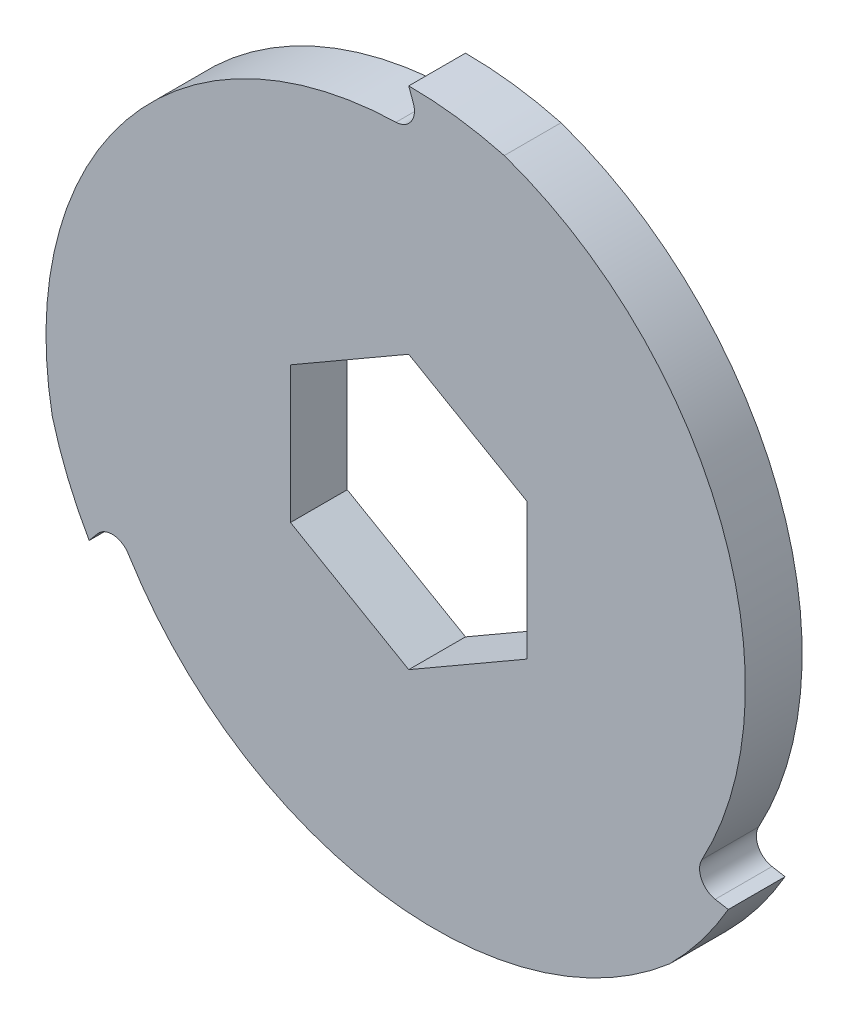
ISO-10303-21;
HEADER;
FILE_DESCRIPTION(('STEP AP214'),'2;1');
FILE_NAME('part.step','',(''),(''),'','','');
FILE_SCHEMA(('AUTOMOTIVE_DESIGN { 1 0 10303 214 1 1 1 1 }'));
ENDSEC;
DATA;
#1=APPLICATION_CONTEXT('core data for automotive mechanical design processes');
#2=APPLICATION_PROTOCOL_DEFINITION('international standard','automotive_design',2000,#1);
#3=PRODUCT_CONTEXT('',#1,'mechanical');
#4=PRODUCT('Part','Part','',(#3));
#5=PRODUCT_RELATED_PRODUCT_CATEGORY('part','',(#4));
#6=PRODUCT_DEFINITION_FORMATION('','',#4);
#7=PRODUCT_DEFINITION_CONTEXT('part definition',#1,'design');
#8=PRODUCT_DEFINITION('design','',#6,#7);
#9=PRODUCT_DEFINITION_SHAPE('','',#8);
#10=(LENGTH_UNIT() NAMED_UNIT(*) SI_UNIT(.MILLI.,.METRE.));
#11=(NAMED_UNIT(*) PLANE_ANGLE_UNIT() SI_UNIT($,.RADIAN.));
#12=(NAMED_UNIT(*) SI_UNIT($,.STERADIAN.) SOLID_ANGLE_UNIT());
#13=UNCERTAINTY_MEASURE_WITH_UNIT(LENGTH_MEASURE(1.E-05),#10,'distance_accuracy_value','');
#14=(GEOMETRIC_REPRESENTATION_CONTEXT(3) GLOBAL_UNCERTAINTY_ASSIGNED_CONTEXT((#13)) GLOBAL_UNIT_ASSIGNED_CONTEXT((#10,
#11,#12)) REPRESENTATION_CONTEXT('',''));
#15=CARTESIAN_POINT('',(0.,0.,0.));
#16=DIRECTION('',(0.,0.,1.));
#17=DIRECTION('',(1.,0.,0.));
#18=AXIS2_PLACEMENT_3D('',#15,#16,#17);
#19=CARTESIAN_POINT('',(43.463727065922,-10.6600377917538,3.));
#20=DIRECTION('',(-0.5,-0.866025403784438,0.));
#21=DIRECTION('',(0.866025403784439,-0.5,0.));
#22=AXIS2_PLACEMENT_3D('',#19,#20,#21);
#23=PLANE('',#22);
#24=DIRECTION('',(-0.866025403784439,0.5,0.));
#25=VECTOR('',#24,1.);
#26=CARTESIAN_POINT('',(43.463727065922,-10.6600377917538,-3.));
#27=LINE('',#26,#25);
#28=CARTESIAN_POINT('',(12.5,7.21687836487032,-3.));
#29=VERTEX_POINT('',#28);
#30=CARTESIAN_POINT('',(0.,14.4337567297407,-3.));
#31=VERTEX_POINT('',#30);
#32=EDGE_CURVE('E245',#29,#31,#27,.T.);
#33=ORIENTED_EDGE('',*,*,#32,.F.);
#34=DIRECTION('',(0.,0.,-1.));
#35=VECTOR('',#34,1.);
#36=CARTESIAN_POINT('',(12.5,7.21687836487032,3.));
#37=LINE('',#36,#35);
#38=CARTESIAN_POINT('',(12.5,7.21687836487032,3.));
#39=VERTEX_POINT('',#38);
#40=EDGE_CURVE('E268',#39,#29,#37,.T.);
#41=ORIENTED_EDGE('',*,*,#40,.F.);
#42=DIRECTION('',(-0.866025403784439,0.5,0.));
#43=VECTOR('',#42,1.);
#44=CARTESIAN_POINT('',(43.463727065922,-10.6600377917538,3.));
#45=LINE('',#44,#43);
#46=CARTESIAN_POINT('',(0.,14.4337567297407,3.));
#47=VERTEX_POINT('',#46);
#48=EDGE_CURVE('E208',#39,#47,#45,.T.);
#49=ORIENTED_EDGE('',*,*,#48,.T.);
#50=DIRECTION('',(0.,0.,-1.));
#51=VECTOR('',#50,1.);
#52=CARTESIAN_POINT('',(0.,14.4337567297407,3.));
#53=LINE('',#52,#51);
#54=EDGE_CURVE('E172',#47,#31,#53,.T.);
#55=ORIENTED_EDGE('',*,*,#54,.T.);
#56=EDGE_LOOP('',(#33,#41,#49,#55));
#57=FACE_BOUND('',#56,.T.);
#58=ADVANCED_FACE('F36',(#57),#23,.T.);
#59=CARTESIAN_POINT('',(12.5,-85.9414213562373,3.));
#60=DIRECTION('',(-1.,0.,0.));
#61=DIRECTION('',(0.,-1.,0.));
#62=AXIS2_PLACEMENT_3D('',#59,#60,#61);
#63=PLANE('',#62);
#64=DIRECTION('',(0.,1.,0.));
#65=VECTOR('',#64,1.);
#66=CARTESIAN_POINT('',(12.5,-85.9414213562373,-3.));
#67=LINE('',#66,#65);
#68=CARTESIAN_POINT('',(12.5,-7.21687836487031,-3.));
#69=VERTEX_POINT('',#68);
#70=EDGE_CURVE('E248',#69,#29,#67,.T.);
#71=ORIENTED_EDGE('',*,*,#70,.F.);
#72=DIRECTION('',(0.,0.,-1.));
#73=VECTOR('',#72,1.);
#74=CARTESIAN_POINT('',(12.5,-7.21687836487031,3.));
#75=LINE('',#74,#73);
#76=CARTESIAN_POINT('',(12.5,-7.21687836487031,3.));
#77=VERTEX_POINT('',#76);
#78=EDGE_CURVE('E266',#77,#69,#75,.T.);
#79=ORIENTED_EDGE('',*,*,#78,.F.);
#80=DIRECTION('',(0.,1.,0.));
#81=VECTOR('',#80,1.);
#82=CARTESIAN_POINT('',(12.5,-85.9414213562373,3.));
#83=LINE('',#82,#81);
#84=EDGE_CURVE('E211',#77,#39,#83,.T.);
#85=ORIENTED_EDGE('',*,*,#84,.T.);
#86=ORIENTED_EDGE('',*,*,#40,.T.);
#87=EDGE_LOOP('',(#71,#79,#85,#86));
#88=FACE_BOUND('',#87,.T.);
#89=ADVANCED_FACE('F320',(#88),#63,.T.);
#90=CARTESIAN_POINT('',(-30.963727065922,-32.3106728863648,3.));
#91=DIRECTION('',(-0.5,0.866025403784438,0.));
#92=DIRECTION('',(-0.866025403784439,-0.5,0.));
#93=AXIS2_PLACEMENT_3D('',#90,#91,#92);
#94=PLANE('',#93);
#95=DIRECTION('',(0.866025403784439,0.5,0.));
#96=VECTOR('',#95,1.);
#97=CARTESIAN_POINT('',(-30.963727065922,-32.3106728863648,-3.));
#98=LINE('',#97,#96);
#99=CARTESIAN_POINT('',(0.,-14.4337567297407,-3.));
#100=VERTEX_POINT('',#99);
#101=EDGE_CURVE('E251',#100,#69,#98,.T.);
#102=ORIENTED_EDGE('',*,*,#101,.F.);
#103=DIRECTION('',(0.,0.,-1.));
#104=VECTOR('',#103,1.);
#105=CARTESIAN_POINT('',(0.,-14.4337567297407,3.));
#106=LINE('',#105,#104);
#107=CARTESIAN_POINT('',(0.,-14.4337567297407,3.));
#108=VERTEX_POINT('',#107);
#109=EDGE_CURVE('E264',#108,#100,#106,.T.);
#110=ORIENTED_EDGE('',*,*,#109,.F.);
#111=DIRECTION('',(0.866025403784439,0.5,0.));
#112=VECTOR('',#111,1.);
#113=CARTESIAN_POINT('',(-30.963727065922,-32.3106728863648,3.));
#114=LINE('',#113,#112);
#115=EDGE_CURVE('E214',#108,#77,#114,.T.);
#116=ORIENTED_EDGE('',*,*,#115,.T.);
#117=ORIENTED_EDGE('',*,*,#78,.T.);
#118=EDGE_LOOP('',(#102,#110,#116,#117));
#119=FACE_BOUND('',#118,.T.);
#120=ADVANCED_FACE('F326',(#119),#94,.T.);
#121=CARTESIAN_POINT('',(30.963727065922,-32.3106728863648,3.));
#122=DIRECTION('',(0.5,0.866025403784439,0.));
#123=DIRECTION('',(-0.866025403784439,0.5,0.));
#124=AXIS2_PLACEMENT_3D('',#121,#122,#123);
#125=PLANE('',#124);
#126=DIRECTION('',(0.866025403784439,-0.5,0.));
#127=VECTOR('',#126,1.);
#128=CARTESIAN_POINT('',(30.963727065922,-32.3106728863648,-3.));
#129=LINE('',#128,#127);
#130=CARTESIAN_POINT('',(-12.5,-7.21687836487032,-3.));
#131=VERTEX_POINT('',#130);
#132=EDGE_CURVE('E254',#131,#100,#129,.T.);
#133=ORIENTED_EDGE('',*,*,#132,.F.);
#134=DIRECTION('',(0.,0.,-1.));
#135=VECTOR('',#134,1.);
#136=CARTESIAN_POINT('',(-12.5,-7.21687836487032,3.));
#137=LINE('',#136,#135);
#138=CARTESIAN_POINT('',(-12.5,-7.21687836487032,3.));
#139=VERTEX_POINT('',#138);
#140=EDGE_CURVE('E262',#139,#131,#137,.T.);
#141=ORIENTED_EDGE('',*,*,#140,.F.);
#142=DIRECTION('',(0.866025403784439,-0.5,0.));
#143=VECTOR('',#142,1.);
#144=CARTESIAN_POINT('',(30.963727065922,-32.3106728863648,3.));
#145=LINE('',#144,#143);
#146=EDGE_CURVE('E217',#139,#108,#145,.T.);
#147=ORIENTED_EDGE('',*,*,#146,.T.);
#148=ORIENTED_EDGE('',*,*,#109,.T.);
#149=EDGE_LOOP('',(#133,#141,#147,#148));
#150=FACE_BOUND('',#149,.T.);
#151=ADVANCED_FACE('F361',(#150),#125,.T.);
#152=CARTESIAN_POINT('',(-12.5,-85.9414213562373,3.));
#153=DIRECTION('',(1.,0.,0.));
#154=DIRECTION('',(0.,1.,0.));
#155=AXIS2_PLACEMENT_3D('',#152,#153,#154);
#156=PLANE('',#155);
#157=DIRECTION('',(0.,-1.,0.));
#158=VECTOR('',#157,1.);
#159=CARTESIAN_POINT('',(-12.5,-85.9414213562373,-3.));
#160=LINE('',#159,#158);
#161=CARTESIAN_POINT('',(-12.5,7.21687836487034,-3.));
#162=VERTEX_POINT('',#161);
#163=EDGE_CURVE('E194',#162,#131,#160,.T.);
#164=ORIENTED_EDGE('',*,*,#163,.F.);
#165=DIRECTION('',(0.,0.,-1.));
#166=VECTOR('',#165,1.);
#167=CARTESIAN_POINT('',(-12.5,7.21687836487034,3.));
#168=LINE('',#167,#166);
#169=CARTESIAN_POINT('',(-12.5,7.21687836487034,3.));
#170=VERTEX_POINT('',#169);
#171=EDGE_CURVE('E260',#170,#162,#168,.T.);
#172=ORIENTED_EDGE('',*,*,#171,.F.);
#173=DIRECTION('',(0.,-1.,0.));
#174=VECTOR('',#173,1.);
#175=CARTESIAN_POINT('',(-12.5,-85.9414213562373,3.));
#176=LINE('',#175,#174);
#177=EDGE_CURVE('E220',#170,#139,#176,.T.);
#178=ORIENTED_EDGE('',*,*,#177,.T.);
#179=ORIENTED_EDGE('',*,*,#140,.T.);
#180=EDGE_LOOP('',(#164,#172,#178,#179));
#181=FACE_BOUND('',#180,.T.);
#182=ADVANCED_FACE('F356',(#181),#156,.T.);
#183=CARTESIAN_POINT('',(-0.34147695629755,-2.98769874534794,3.));
#184=DIRECTION('',(0.,0.,-1.));
#185=DIRECTION('',(-1.,0.,0.));
#186=AXIS2_PLACEMENT_3D('',#183,#184,#185);
#187=CYLINDRICAL_SURFACE('',#186,38.0000000000001);
#188=CARTESIAN_POINT('',(-0.34147695629755,-2.98769874534794,3.));
#189=DIRECTION('',(0.,0.,1.));
#190=DIRECTION('',(1.,0.,0.));
#191=AXIS2_PLACEMENT_3D('',#188,#189,#190);
#192=CIRCLE('',#191,38.0000000000001);
#193=CARTESIAN_POINT('',(-37.671107225274,-10.0939427589969,3.));
#194=VERTEX_POINT('',#193);
#195=CARTESIAN_POINT('',(-1.34687977799022,34.9989984678363,3.));
#196=VERTEX_POINT('',#195);
#197=EDGE_CURVE('E166',#194,#196,#192,.F.);
#198=ORIENTED_EDGE('',*,*,#197,.T.);
#199=DIRECTION('',(0.,0.,-1.));
#200=VECTOR('',#199,1.);
#201=CARTESIAN_POINT('',(-1.34687977799022,34.9989984678363,3.));
#202=LINE('',#201,#200);
#203=CARTESIAN_POINT('',(-1.34687977799022,34.9989984678363,-3.));
#204=VERTEX_POINT('',#203);
#205=EDGE_CURVE('E285',#196,#204,#202,.T.);
#206=ORIENTED_EDGE('',*,*,#205,.T.);
#207=CARTESIAN_POINT('',(-0.34147695629755,-2.98769874534794,-3.));
#208=DIRECTION('',(0.,0.,1.));
#209=DIRECTION('',(1.,0.,0.));
#210=AXIS2_PLACEMENT_3D('',#207,#208,#209);
#211=CIRCLE('',#210,38.0000000000001);
#212=CARTESIAN_POINT('',(-37.671107225274,-10.0939427589969,-3.));
#213=VERTEX_POINT('',#212);
#214=EDGE_CURVE('E169',#213,#204,#211,.F.);
#215=ORIENTED_EDGE('',*,*,#214,.F.);
#216=DIRECTION('',(0.,0.,-1.));
#217=VECTOR('',#216,1.);
#218=CARTESIAN_POINT('',(-37.671107225274,-10.0939427589969,3.));
#219=LINE('',#218,#217);
#220=EDGE_CURVE('E161',#194,#213,#219,.T.);
#221=ORIENTED_EDGE('',*,*,#220,.F.);
#222=EDGE_LOOP('',(#198,#206,#215,#221));
#223=FACE_BOUND('',#222,.T.);
#224=ADVANCED_FACE('F163',(#223),#187,.T.);
#225=CARTESIAN_POINT('',(0.,0.,3.));
#226=DIRECTION('',(0.,0.,-1.));
#227=DIRECTION('',(-1.,0.,0.));
#228=AXIS2_PLACEMENT_3D('',#225,#226,#227);
#229=CYLINDRICAL_SURFACE('',#228,39.);
#230=CARTESIAN_POINT('',(0.,0.,-3.));
#231=DIRECTION('',(0.,0.,1.));
#232=DIRECTION('',(1.,0.,0.));
#233=AXIS2_PLACEMENT_3D('',#230,#231,#232);
#234=CIRCLE('',#233,39.);
#235=CARTESIAN_POINT('',(-33.7749907475925,-19.5000000000005,-3.));
#236=VERTEX_POINT('',#235);
#237=EDGE_CURVE('E228',#213,#236,#234,.T.);
#238=ORIENTED_EDGE('',*,*,#237,.T.);
#239=DIRECTION('',(0.,0.,-1.));
#240=VECTOR('',#239,1.);
#241=CARTESIAN_POINT('',(-33.7749907475925,-19.5000000000005,3.));
#242=LINE('',#241,#240);
#243=CARTESIAN_POINT('',(-33.7749907475925,-19.5000000000005,3.));
#244=VERTEX_POINT('',#243);
#245=EDGE_CURVE('E173',#244,#236,#242,.T.);
#246=ORIENTED_EDGE('',*,*,#245,.F.);
#247=CARTESIAN_POINT('',(0.,0.,3.));
#248=DIRECTION('',(0.,0.,1.));
#249=DIRECTION('',(1.,0.,0.));
#250=AXIS2_PLACEMENT_3D('',#247,#248,#249);
#251=CIRCLE('',#250,39.);
#252=EDGE_CURVE('E176',#194,#244,#251,.T.);
#253=ORIENTED_EDGE('',*,*,#252,.F.);
#254=ORIENTED_EDGE('',*,*,#220,.T.);
#255=EDGE_LOOP('',(#238,#246,#253,#254));
#256=FACE_BOUND('',#255,.T.);
#257=ADVANCED_FACE('F177',(#256),#229,.T.);
#258=CARTESIAN_POINT('',(-52.5359916072048,-41.8584901751143,3.));
#259=DIRECTION('',(-0.766044443119088,0.642787609686409,0.));
#260=DIRECTION('',(-0.642787609686409,-0.766044443119088,0.));
#261=AXIS2_PLACEMENT_3D('',#258,#259,#260);
#262=PLANE('',#261);
#263=DIRECTION('',(0.642787609686409,0.766044443119088,0.));
#264=VECTOR('',#263,1.);
#265=CARTESIAN_POINT('',(-52.5359916072048,-41.8584901751143,-3.));
#266=LINE('',#265,#264);
#267=CARTESIAN_POINT('',(-32.8736572711721,-18.4258325913506,-3.));
#268=VERTEX_POINT('',#267);
#269=EDGE_CURVE('E230',#236,#268,#266,.T.);
#270=ORIENTED_EDGE('',*,*,#269,.T.);
#271=DIRECTION('',(0.,0.,-1.));
#272=VECTOR('',#271,1.);
#273=CARTESIAN_POINT('',(-32.8736572711721,-18.4258325913506,3.));
#274=LINE('',#273,#272);
#275=CARTESIAN_POINT('',(-32.8736572711721,-18.4258325913506,3.));
#276=VERTEX_POINT('',#275);
#277=EDGE_CURVE('E283',#268,#276,#274,.F.);
#278=ORIENTED_EDGE('',*,*,#277,.T.);
#279=DIRECTION('',(0.642787609686409,0.766044443119088,0.));
#280=VECTOR('',#279,1.);
#281=CARTESIAN_POINT('',(-52.5359916072048,-41.8584901751143,3.));
#282=LINE('',#281,#280);
#283=EDGE_CURVE('E182',#244,#276,#282,.T.);
#284=ORIENTED_EDGE('',*,*,#283,.F.);
#285=ORIENTED_EDGE('',*,*,#245,.T.);
#286=EDGE_LOOP('',(#270,#278,#284,#285));
#287=FACE_BOUND('',#286,.T.);
#288=ADVANCED_FACE('F350',(#287),#262,.F.);
#289=CARTESIAN_POINT('',(2.75816149047498,1.1981216537133,3.));
#290=DIRECTION('',(0.,0.,-1.));
#291=DIRECTION('',(-1.,0.,0.));
#292=AXIS2_PLACEMENT_3D('',#289,#290,#291);
#293=CYLINDRICAL_SURFACE('',#292,38.);
#294=CARTESIAN_POINT('',(2.75816149047498,1.1981216537133,3.));
#295=DIRECTION('',(0.,0.,1.));
#296=DIRECTION('',(1.,0.,0.));
#297=AXIS2_PLACEMENT_3D('',#294,#295,#296);
#298=CIRCLE('',#297,38.);
#299=CARTESIAN_POINT('',(27.5771644662752,-27.5771644662755,3.));
#300=VERTEX_POINT('',#299);
#301=CARTESIAN_POINT('',(-29.6365818911634,-18.6659313375016,3.));
#302=VERTEX_POINT('',#301);
#303=EDGE_CURVE('E198',#300,#302,#298,.F.);
#304=ORIENTED_EDGE('',*,*,#303,.T.);
#305=DIRECTION('',(0.,0.,-1.));
#306=VECTOR('',#305,1.);
#307=CARTESIAN_POINT('',(-29.6365818911634,-18.6659313375016,3.));
#308=LINE('',#307,#306);
#309=CARTESIAN_POINT('',(-29.6365818911634,-18.6659313375016,-3.));
#310=VERTEX_POINT('',#309);
#311=EDGE_CURVE('E270',#302,#310,#308,.T.);
#312=ORIENTED_EDGE('',*,*,#311,.T.);
#313=CARTESIAN_POINT('',(2.75816149047498,1.1981216537133,-3.));
#314=DIRECTION('',(0.,0.,1.));
#315=DIRECTION('',(1.,0.,0.));
#316=AXIS2_PLACEMENT_3D('',#313,#314,#315);
#317=CIRCLE('',#316,38.);
#318=CARTESIAN_POINT('',(27.5771644662752,-27.5771644662755,-3.));
#319=VERTEX_POINT('',#318);
#320=EDGE_CURVE('E235',#319,#310,#317,.F.);
#321=ORIENTED_EDGE('',*,*,#320,.F.);
#322=DIRECTION('',(0.,0.,-1.));
#323=VECTOR('',#322,1.);
#324=CARTESIAN_POINT('',(27.5771644662752,-27.5771644662755,3.));
#325=LINE('',#324,#323);
#326=EDGE_CURVE('E278',#300,#319,#325,.T.);
#327=ORIENTED_EDGE('',*,*,#326,.F.);
#328=EDGE_LOOP('',(#304,#312,#321,#327));
#329=FACE_BOUND('',#328,.T.);
#330=ADVANCED_FACE('F347',(#329),#293,.T.);
#331=CARTESIAN_POINT('',(33.7749907475938,-19.4999999999997,-3.));
#332=VERTEX_POINT('',#331);
#333=EDGE_CURVE('E232',#319,#332,#234,.T.);
#334=ORIENTED_EDGE('',*,*,#333,.T.);
#335=DIRECTION('',(0.,0.,-1.));
#336=VECTOR('',#335,1.);
#337=CARTESIAN_POINT('',(33.7749907475938,-19.4999999999997,3.));
#338=LINE('',#337,#336);
#339=CARTESIAN_POINT('',(33.7749907475938,-19.4999999999997,3.));
#340=VERTEX_POINT('',#339);
#341=EDGE_CURVE('E275',#340,#332,#338,.T.);
#342=ORIENTED_EDGE('',*,*,#341,.F.);
#343=EDGE_CURVE('E185',#300,#340,#251,.T.);
#344=ORIENTED_EDGE('',*,*,#343,.F.);
#345=ORIENTED_EDGE('',*,*,#326,.T.);
#346=EDGE_LOOP('',(#334,#342,#344,#345));
#347=FACE_BOUND('',#346,.T.);
#348=ADVANCED_FACE('F340',(#347),#229,.T.);
#349=CARTESIAN_POINT('',(12.3805928149876,-15.7275904084699,3.));
#350=DIRECTION('',(-0.173648177666837,-0.984807753012224,0.));
#351=DIRECTION('',(0.984807753012224,-0.173648177666837,0.));
#352=AXIS2_PLACEMENT_3D('',#349,#350,#351);
#353=PLANE('',#352);
#354=DIRECTION('',(-0.984807753012224,0.173648177666837,0.));
#355=VECTOR('',#354,1.);
#356=CARTESIAN_POINT('',(12.3805928149876,-15.7275904084699,-3.));
#357=LINE('',#356,#355);
#358=CARTESIAN_POINT('',(32.3940677455747,-19.2565060164629,-3.));
#359=VERTEX_POINT('',#358);
#360=EDGE_CURVE('E238',#332,#359,#357,.T.);
#361=ORIENTED_EDGE('',*,*,#360,.T.);
#362=DIRECTION('',(0.,0.,-1.));
#363=VECTOR('',#362,1.);
#364=CARTESIAN_POINT('',(32.3940677455747,-19.2565060164629,3.));
#365=LINE('',#364,#363);
#366=CARTESIAN_POINT('',(32.3940677455747,-19.2565060164629,3.));
#367=VERTEX_POINT('',#366);
#368=EDGE_CURVE('E51',#359,#367,#365,.F.);
#369=ORIENTED_EDGE('',*,*,#368,.T.);
#370=DIRECTION('',(-0.984807753012224,0.173648177666837,0.));
#371=VECTOR('',#370,1.);
#372=CARTESIAN_POINT('',(12.3805928149876,-15.7275904084699,3.));
#373=LINE('',#372,#371);
#374=EDGE_CURVE('E201',#340,#367,#373,.T.);
#375=ORIENTED_EDGE('',*,*,#374,.F.);
#376=ORIENTED_EDGE('',*,*,#341,.T.);
#377=EDGE_LOOP('',(#361,#369,#375,#376));
#378=FACE_BOUND('',#377,.T.);
#379=ADVANCED_FACE('F343',(#378),#353,.F.);
#380=CARTESIAN_POINT('',(-2.41668453417743,1.78957709163463,3.));
#381=DIRECTION('',(0.,0.,-1.));
#382=DIRECTION('',(-1.,0.,0.));
#383=AXIS2_PLACEMENT_3D('',#380,#381,#382);
#384=CYLINDRICAL_SURFACE('',#383,38.);
#385=CARTESIAN_POINT('',(-2.41668453417743,1.78957709163463,3.));
#386=DIRECTION('',(0.,0.,1.));
#387=DIRECTION('',(1.,0.,0.));
#388=AXIS2_PLACEMENT_3D('',#385,#386,#387);
#389=CIRCLE('',#388,38.);
#390=CARTESIAN_POINT('',(10.0939427589983,37.6711072252737,3.));
#391=VERTEX_POINT('',#390);
#392=CARTESIAN_POINT('',(30.983461669154,-16.3330671303348,3.));
#393=VERTEX_POINT('',#392);
#394=EDGE_CURVE('E203',#391,#393,#389,.F.);
#395=ORIENTED_EDGE('',*,*,#394,.T.);
#396=DIRECTION('',(0.,0.,-1.));
#397=VECTOR('',#396,1.);
#398=CARTESIAN_POINT('',(30.983461669154,-16.3330671303348,3.));
#399=LINE('',#398,#397);
#400=CARTESIAN_POINT('',(30.983461669154,-16.3330671303348,-3.));
#401=VERTEX_POINT('',#400);
#402=EDGE_CURVE('E289',#393,#401,#399,.T.);
#403=ORIENTED_EDGE('',*,*,#402,.T.);
#404=CARTESIAN_POINT('',(-2.41668453417743,1.78957709163463,-3.));
#405=DIRECTION('',(0.,0.,1.));
#406=DIRECTION('',(1.,0.,0.));
#407=AXIS2_PLACEMENT_3D('',#404,#405,#406);
#408=CIRCLE('',#407,38.);
#409=CARTESIAN_POINT('',(10.0939427589983,37.6711072252737,-3.));
#410=VERTEX_POINT('',#409);
#411=EDGE_CURVE('E240',#410,#401,#408,.F.);
#412=ORIENTED_EDGE('',*,*,#411,.F.);
#413=DIRECTION('',(0.,0.,-1.));
#414=VECTOR('',#413,1.);
#415=CARTESIAN_POINT('',(10.0939427589983,37.6711072252737,3.));
#416=LINE('',#415,#414);
#417=EDGE_CURVE('E273',#391,#410,#416,.T.);
#418=ORIENTED_EDGE('',*,*,#417,.F.);
#419=EDGE_LOOP('',(#395,#403,#412,#418));
#420=FACE_BOUND('',#419,.T.);
#421=ADVANCED_FACE('F338',(#420),#384,.T.);
#422=CARTESIAN_POINT('',(0.,39.,-3.));
#423=VERTEX_POINT('',#422);
#424=EDGE_CURVE('E231',#410,#423,#234,.T.);
#425=ORIENTED_EDGE('',*,*,#424,.T.);
#426=DIRECTION('',(0.,0.,-1.));
#427=VECTOR('',#426,1.);
#428=CARTESIAN_POINT('',(0.,39.,3.));
#429=LINE('',#428,#427);
#430=CARTESIAN_POINT('',(0.,39.,3.));
#431=VERTEX_POINT('',#430);
#432=EDGE_CURVE('E226',#431,#423,#429,.T.);
#433=ORIENTED_EDGE('',*,*,#432,.F.);
#434=EDGE_CURVE('E184',#391,#431,#251,.T.);
#435=ORIENTED_EDGE('',*,*,#434,.F.);
#436=ORIENTED_EDGE('',*,*,#417,.T.);
#437=EDGE_LOOP('',(#425,#433,#435,#436));
#438=FACE_BOUND('',#437,.T.);
#439=ADVANCED_FACE('F335',(#438),#229,.T.);
#440=CARTESIAN_POINT('',(40.1553987922067,-71.3260514507853,3.));
#441=DIRECTION('',(0.93969262078591,0.342020143325663,0.));
#442=DIRECTION('',(-0.342020143325663,0.93969262078591,0.));
#443=AXIS2_PLACEMENT_3D('',#440,#441,#442);
#444=PLANE('',#443);
#445=DIRECTION('',(0.342020143325663,-0.93969262078591,0.));
#446=VECTOR('',#445,1.);
#447=CARTESIAN_POINT('',(40.1553987922067,-71.3260514507853,-3.));
#448=LINE('',#447,#446);
#449=CARTESIAN_POINT('',(0.479589525597776,37.6823386078131,-3.));
#450=VERTEX_POINT('',#449);
#451=EDGE_CURVE('E242',#423,#450,#448,.T.);
#452=ORIENTED_EDGE('',*,*,#451,.T.);
#453=DIRECTION('',(0.,0.,-1.));
#454=VECTOR('',#453,1.);
#455=CARTESIAN_POINT('',(0.479589525597783,37.6823386078131,3.));
#456=LINE('',#455,#454);
#457=CARTESIAN_POINT('',(0.479589525597776,37.6823386078131,3.));
#458=VERTEX_POINT('',#457);
#459=EDGE_CURVE('E287',#450,#458,#456,.F.);
#460=ORIENTED_EDGE('',*,*,#459,.T.);
#461=DIRECTION('',(0.342020143325663,-0.93969262078591,0.));
#462=VECTOR('',#461,1.);
#463=CARTESIAN_POINT('',(40.1553987922067,-71.3260514507853,3.));
#464=LINE('',#463,#462);
#465=EDGE_CURVE('E206',#431,#458,#464,.T.);
#466=ORIENTED_EDGE('',*,*,#465,.F.);
#467=ORIENTED_EDGE('',*,*,#432,.T.);
#468=EDGE_LOOP('',(#452,#460,#466,#467));
#469=FACE_BOUND('',#468,.T.);
#470=ADVANCED_FACE('F306',(#469),#444,.F.);
#471=CARTESIAN_POINT('',(-43.463727065922,-10.6600377917538,3.));
#472=DIRECTION('',(0.5,-0.866025403784438,0.));
#473=DIRECTION('',(0.866025403784439,0.5,0.));
#474=AXIS2_PLACEMENT_3D('',#471,#472,#473);
#475=PLANE('',#474);
#476=DIRECTION('',(-0.866025403784439,-0.5,0.));
#477=VECTOR('',#476,1.);
#478=CARTESIAN_POINT('',(-43.463727065922,-10.6600377917538,-3.));
#479=LINE('',#478,#477);
#480=EDGE_CURVE('E191',#31,#162,#479,.T.);
#481=ORIENTED_EDGE('',*,*,#480,.F.);
#482=ORIENTED_EDGE('',*,*,#54,.F.);
#483=DIRECTION('',(-0.866025403784439,-0.5,0.));
#484=VECTOR('',#483,1.);
#485=CARTESIAN_POINT('',(-43.463727065922,-10.6600377917538,3.));
#486=LINE('',#485,#484);
#487=EDGE_CURVE('E223',#47,#170,#486,.T.);
#488=ORIENTED_EDGE('',*,*,#487,.T.);
#489=ORIENTED_EDGE('',*,*,#171,.T.);
#490=EDGE_LOOP('',(#481,#482,#488,#489));
#491=FACE_BOUND('',#490,.T.);
#492=ADVANCED_FACE('F334',(#491),#475,.T.);
#493=CARTESIAN_POINT('',(0.,-85.9414213562373,3.));
#494=DIRECTION('',(0.,0.,1.));
#495=DIRECTION('',(1.,0.,0.));
#496=AXIS2_PLACEMENT_3D('',#493,#494,#495);
#497=PLANE('',#496);
#498=ORIENTED_EDGE('',*,*,#197,.F.);
#499=ORIENTED_EDGE('',*,*,#252,.T.);
#500=ORIENTED_EDGE('',*,*,#283,.T.);
#501=CARTESIAN_POINT('',(-31.3415683849339,-19.7114078107234,3.));
#502=DIRECTION('',(0.,0.,1.));
#503=DIRECTION('',(1.,0.,0.));
#504=AXIS2_PLACEMENT_3D('',#501,#502,#503);
#505=CIRCLE('',#504,2.);
#506=EDGE_CURVE('E295',#276,#302,#505,.F.);
#507=ORIENTED_EDGE('',*,*,#506,.T.);
#508=ORIENTED_EDGE('',*,*,#303,.F.);
#509=ORIENTED_EDGE('',*,*,#343,.T.);
#510=ORIENTED_EDGE('',*,*,#374,.T.);
#511=CARTESIAN_POINT('',(32.7413641009083,-17.2868905104384,3.));
#512=DIRECTION('',(0.,0.,1.));
#513=DIRECTION('',(1.,0.,0.));
#514=AXIS2_PLACEMENT_3D('',#511,#512,#513);
#515=CIRCLE('',#514,2.);
#516=EDGE_CURVE('E11',#367,#393,#515,.F.);
#517=ORIENTED_EDGE('',*,*,#516,.T.);
#518=ORIENTED_EDGE('',*,*,#394,.F.);
#519=ORIENTED_EDGE('',*,*,#434,.T.);
#520=ORIENTED_EDGE('',*,*,#465,.T.);
#521=CARTESIAN_POINT('',(-1.39979571597405,36.9982983211618,3.));
#522=DIRECTION('',(0.,0.,1.));
#523=DIRECTION('',(1.,0.,0.));
#524=AXIS2_PLACEMENT_3D('',#521,#522,#523);
#525=CIRCLE('',#524,2.);
#526=EDGE_CURVE('E190',#458,#196,#525,.F.);
#527=ORIENTED_EDGE('',*,*,#526,.T.);
#528=EDGE_LOOP('',(#498,#499,#500,#507,#508,#509,#510,#517,#518,#519,#520,#527));
#529=FACE_BOUND('',#528,.T.);
#530=ORIENTED_EDGE('',*,*,#48,.F.);
#531=ORIENTED_EDGE('',*,*,#84,.F.);
#532=ORIENTED_EDGE('',*,*,#115,.F.);
#533=ORIENTED_EDGE('',*,*,#146,.F.);
#534=ORIENTED_EDGE('',*,*,#177,.F.);
#535=ORIENTED_EDGE('',*,*,#487,.F.);
#536=EDGE_LOOP('',(#530,#531,#532,#533,#534,#535));
#537=FACE_BOUND('',#536,.T.);
#538=ADVANCED_FACE('F186',(#529,#537),#497,.T.);
#539=CARTESIAN_POINT('',(0.,-85.9414213562373,-3.));
#540=DIRECTION('',(0.,0.,1.));
#541=DIRECTION('',(1.,0.,0.));
#542=AXIS2_PLACEMENT_3D('',#539,#540,#541);
#543=PLANE('',#542);
#544=ORIENTED_EDGE('',*,*,#214,.T.);
#545=CARTESIAN_POINT('',(-1.39979571597405,36.9982983211618,-3.));
#546=DIRECTION('',(0.,0.,1.));
#547=DIRECTION('',(1.,0.,0.));
#548=AXIS2_PLACEMENT_3D('',#545,#546,#547);
#549=CIRCLE('',#548,2.);
#550=EDGE_CURVE('E297',#204,#450,#549,.T.);
#551=ORIENTED_EDGE('',*,*,#550,.T.);
#552=ORIENTED_EDGE('',*,*,#451,.F.);
#553=ORIENTED_EDGE('',*,*,#424,.F.);
#554=ORIENTED_EDGE('',*,*,#411,.T.);
#555=CARTESIAN_POINT('',(32.7413641009083,-17.2868905104384,-3.));
#556=DIRECTION('',(0.,0.,1.));
#557=DIRECTION('',(1.,0.,0.));
#558=AXIS2_PLACEMENT_3D('',#555,#556,#557);
#559=CIRCLE('',#558,2.);
#560=EDGE_CURVE('E44',#401,#359,#559,.T.);
#561=ORIENTED_EDGE('',*,*,#560,.T.);
#562=ORIENTED_EDGE('',*,*,#360,.F.);
#563=ORIENTED_EDGE('',*,*,#333,.F.);
#564=ORIENTED_EDGE('',*,*,#320,.T.);
#565=CARTESIAN_POINT('',(-31.3415683849339,-19.7114078107234,-3.));
#566=DIRECTION('',(0.,0.,1.));
#567=DIRECTION('',(1.,0.,0.));
#568=AXIS2_PLACEMENT_3D('',#565,#566,#567);
#569=CIRCLE('',#568,2.);
#570=EDGE_CURVE('E293',#310,#268,#569,.T.);
#571=ORIENTED_EDGE('',*,*,#570,.T.);
#572=ORIENTED_EDGE('',*,*,#269,.F.);
#573=ORIENTED_EDGE('',*,*,#237,.F.);
#574=EDGE_LOOP('',(#544,#551,#552,#553,#554,#561,#562,#563,#564,#571,#572,#573));
#575=FACE_BOUND('',#574,.T.);
#576=ORIENTED_EDGE('',*,*,#32,.T.);
#577=ORIENTED_EDGE('',*,*,#480,.T.);
#578=ORIENTED_EDGE('',*,*,#163,.T.);
#579=ORIENTED_EDGE('',*,*,#132,.T.);
#580=ORIENTED_EDGE('',*,*,#101,.T.);
#581=ORIENTED_EDGE('',*,*,#70,.T.);
#582=EDGE_LOOP('',(#576,#577,#578,#579,#580,#581));
#583=FACE_BOUND('',#582,.T.);
#584=ADVANCED_FACE('F300',(#575,#583),#543,.F.);
#585=CARTESIAN_POINT('',(-31.3415683849339,-19.7114078107234,3.));
#586=DIRECTION('',(0.,0.,-1.));
#587=DIRECTION('',(-1.,0.,0.));
#588=AXIS2_PLACEMENT_3D('',#585,#586,#587);
#589=CYLINDRICAL_SURFACE('',#588,2.);
#590=ORIENTED_EDGE('',*,*,#506,.F.);
#591=ORIENTED_EDGE('',*,*,#277,.F.);
#592=ORIENTED_EDGE('',*,*,#570,.F.);
#593=ORIENTED_EDGE('',*,*,#311,.F.);
#594=EDGE_LOOP('',(#590,#591,#592,#593));
#595=FACE_BOUND('',#594,.T.);
#596=ADVANCED_FACE('F311',(#595),#589,.F.);
#597=CARTESIAN_POINT('',(-1.39979571597405,36.9982983211618,3.));
#598=DIRECTION('',(0.,0.,-1.));
#599=DIRECTION('',(-1.,0.,0.));
#600=AXIS2_PLACEMENT_3D('',#597,#598,#599);
#601=CYLINDRICAL_SURFACE('',#600,2.);
#602=ORIENTED_EDGE('',*,*,#526,.F.);
#603=ORIENTED_EDGE('',*,*,#459,.F.);
#604=ORIENTED_EDGE('',*,*,#550,.F.);
#605=ORIENTED_EDGE('',*,*,#205,.F.);
#606=EDGE_LOOP('',(#602,#603,#604,#605));
#607=FACE_BOUND('',#606,.T.);
#608=ADVANCED_FACE('F309',(#607),#601,.F.);
#609=CARTESIAN_POINT('',(32.7413641009083,-17.2868905104384,3.));
#610=DIRECTION('',(0.,0.,-1.));
#611=DIRECTION('',(-1.,0.,0.));
#612=AXIS2_PLACEMENT_3D('',#609,#610,#611);
#613=CYLINDRICAL_SURFACE('',#612,2.);
#614=ORIENTED_EDGE('',*,*,#516,.F.);
#615=ORIENTED_EDGE('',*,*,#368,.F.);
#616=ORIENTED_EDGE('',*,*,#560,.F.);
#617=ORIENTED_EDGE('',*,*,#402,.F.);
#618=EDGE_LOOP('',(#614,#615,#616,#617));
#619=FACE_BOUND('',#618,.T.);
#620=ADVANCED_FACE('F38',(#619),#613,.F.);
#621=CLOSED_SHELL('',(#58,#89,#120,#151,#182,#224,#257,#288,#330,#348,#379,#421,#439,#470,#492,
#538,#584,#596,#608,#620));
#622=MANIFOLD_SOLID_BREP('B2',#621);
#623=ADVANCED_BREP_SHAPE_REPRESENTATION('',(#18,#622),#14);
#624=SHAPE_DEFINITION_REPRESENTATION(#9,#623);
ENDSEC;
END-ISO-10303-21;
